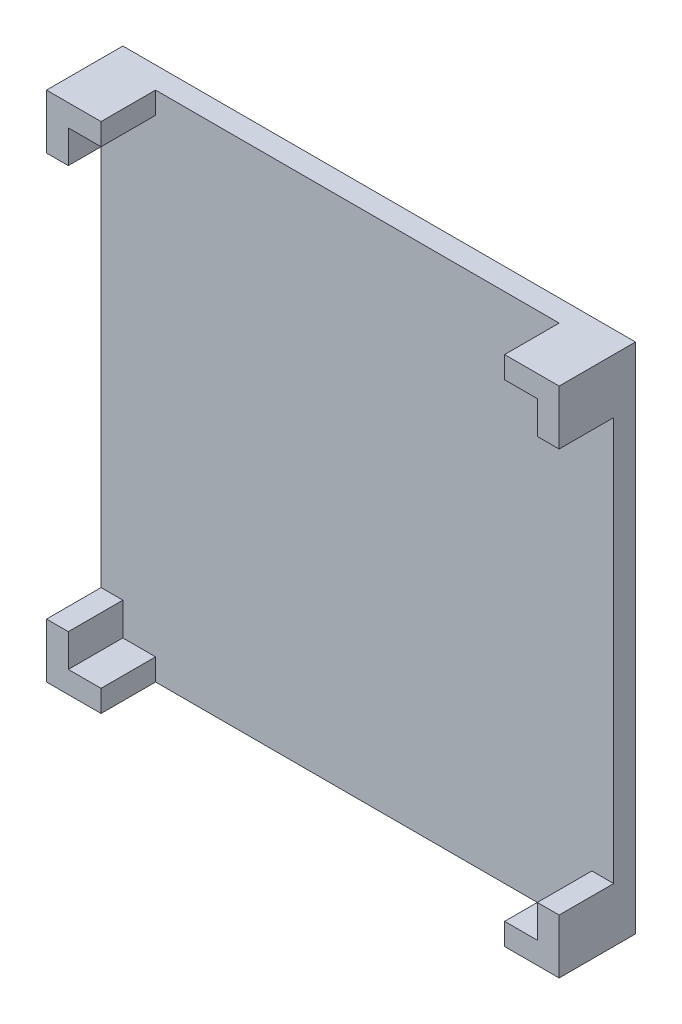
ISO-10303-21;
HEADER;
FILE_DESCRIPTION(('STEP AP214'),'2;1');
FILE_NAME('part.step','',(''),(''),'','','');
FILE_SCHEMA(('AUTOMOTIVE_DESIGN { 1 0 10303 214 1 1 1 1 }'));
ENDSEC;
DATA;
#1=APPLICATION_CONTEXT('core data for automotive mechanical design processes');
#2=APPLICATION_PROTOCOL_DEFINITION('international standard','automotive_design',2000,#1);
#3=PRODUCT_CONTEXT('',#1,'mechanical');
#4=PRODUCT('Part','Part','',(#3));
#5=PRODUCT_RELATED_PRODUCT_CATEGORY('part','',(#4));
#6=PRODUCT_DEFINITION_FORMATION('','',#4);
#7=PRODUCT_DEFINITION_CONTEXT('part definition',#1,'design');
#8=PRODUCT_DEFINITION('design','',#6,#7);
#9=PRODUCT_DEFINITION_SHAPE('','',#8);
#10=(LENGTH_UNIT() NAMED_UNIT(*) SI_UNIT(.MILLI.,.METRE.));
#11=(NAMED_UNIT(*) PLANE_ANGLE_UNIT() SI_UNIT($,.RADIAN.));
#12=(NAMED_UNIT(*) SI_UNIT($,.STERADIAN.) SOLID_ANGLE_UNIT());
#13=UNCERTAINTY_MEASURE_WITH_UNIT(LENGTH_MEASURE(1.E-05),#10,'distance_accuracy_value','');
#14=(GEOMETRIC_REPRESENTATION_CONTEXT(3) GLOBAL_UNCERTAINTY_ASSIGNED_CONTEXT((#13)) GLOBAL_UNIT_ASSIGNED_CONTEXT((#10,
#11,#12)) REPRESENTATION_CONTEXT('',''));
#15=CARTESIAN_POINT('',(0.,0.,0.));
#16=DIRECTION('',(0.,0.,1.));
#17=DIRECTION('',(1.,0.,0.));
#18=AXIS2_PLACEMENT_3D('',#15,#16,#17);
#19=CARTESIAN_POINT('',(0.,0.,2.));
#20=DIRECTION('',(0.,0.,1.));
#21=DIRECTION('',(1.,0.,0.));
#22=AXIS2_PLACEMENT_3D('',#19,#20,#21);
#23=PLANE('',#22);
#24=DIRECTION('',(0.,-1.,0.));
#25=VECTOR('',#24,1.);
#26=CARTESIAN_POINT('',(45.,5.,2.));
#27=LINE('',#26,#25);
#28=CARTESIAN_POINT('',(45.,5.,2.));
#29=VERTEX_POINT('',#28);
#30=CARTESIAN_POINT('',(45.,2.,2.));
#31=VERTEX_POINT('',#30);
#32=EDGE_CURVE('E48',#29,#31,#27,.T.);
#33=ORIENTED_EDGE('',*,*,#32,.F.);
#34=DIRECTION('',(-1.,0.,0.));
#35=VECTOR('',#34,1.);
#36=CARTESIAN_POINT('',(47.,5.,2.));
#37=LINE('',#36,#35);
#38=CARTESIAN_POINT('',(47.,5.,2.));
#39=VERTEX_POINT('',#38);
#40=EDGE_CURVE('E463',#39,#29,#37,.T.);
#41=ORIENTED_EDGE('',*,*,#40,.F.);
#42=DIRECTION('',(0.,1.,0.));
#43=VECTOR('',#42,1.);
#44=CARTESIAN_POINT('',(47.,0.,2.));
#45=LINE('',#44,#43);
#46=CARTESIAN_POINT('',(47.,42.,2.));
#47=VERTEX_POINT('',#46);
#48=EDGE_CURVE('E216',#39,#47,#45,.T.);
#49=ORIENTED_EDGE('',*,*,#48,.T.);
#50=DIRECTION('',(1.,0.,0.));
#51=VECTOR('',#50,1.);
#52=CARTESIAN_POINT('',(45.,42.,2.));
#53=LINE('',#52,#51);
#54=CARTESIAN_POINT('',(45.,42.,2.));
#55=VERTEX_POINT('',#54);
#56=EDGE_CURVE('E268',#55,#47,#53,.T.);
#57=ORIENTED_EDGE('',*,*,#56,.F.);
#58=DIRECTION('',(0.,-1.,0.));
#59=VECTOR('',#58,1.);
#60=CARTESIAN_POINT('',(45.,45.,2.));
#61=LINE('',#60,#59);
#62=CARTESIAN_POINT('',(45.,45.,2.));
#63=VERTEX_POINT('',#62);
#64=EDGE_CURVE('E285',#63,#55,#61,.T.);
#65=ORIENTED_EDGE('',*,*,#64,.F.);
#66=DIRECTION('',(1.,0.,0.));
#67=VECTOR('',#66,1.);
#68=CARTESIAN_POINT('',(42.,45.,2.));
#69=LINE('',#68,#67);
#70=CARTESIAN_POINT('',(42.,45.,2.));
#71=VERTEX_POINT('',#70);
#72=EDGE_CURVE('E282',#71,#63,#69,.T.);
#73=ORIENTED_EDGE('',*,*,#72,.F.);
#74=DIRECTION('',(0.,-1.,0.));
#75=VECTOR('',#74,1.);
#76=CARTESIAN_POINT('',(42.,47.,2.));
#77=LINE('',#76,#75);
#78=CARTESIAN_POINT('',(42.,47.,2.));
#79=VERTEX_POINT('',#78);
#80=EDGE_CURVE('E263',#79,#71,#77,.T.);
#81=ORIENTED_EDGE('',*,*,#80,.F.);
#82=DIRECTION('',(-1.,0.,0.));
#83=VECTOR('',#82,1.);
#84=CARTESIAN_POINT('',(47.,47.,2.));
#85=LINE('',#84,#83);
#86=CARTESIAN_POINT('',(5.,47.,2.));
#87=VERTEX_POINT('',#86);
#88=EDGE_CURVE('E350',#79,#87,#85,.T.);
#89=ORIENTED_EDGE('',*,*,#88,.T.);
#90=DIRECTION('',(0.,1.,0.));
#91=VECTOR('',#90,1.);
#92=CARTESIAN_POINT('',(5.,47.,2.));
#93=LINE('',#92,#91);
#94=CARTESIAN_POINT('',(5.,45.,2.));
#95=VERTEX_POINT('',#94);
#96=EDGE_CURVE('E308',#95,#87,#93,.T.);
#97=ORIENTED_EDGE('',*,*,#96,.F.);
#98=DIRECTION('',(1.,0.,0.));
#99=VECTOR('',#98,1.);
#100=CARTESIAN_POINT('',(5.,45.,2.));
#101=LINE('',#100,#99);
#102=CARTESIAN_POINT('',(2.,45.,2.));
#103=VERTEX_POINT('',#102);
#104=EDGE_CURVE('E324',#103,#95,#101,.T.);
#105=ORIENTED_EDGE('',*,*,#104,.F.);
#106=DIRECTION('',(0.,1.,0.));
#107=VECTOR('',#106,1.);
#108=CARTESIAN_POINT('',(2.,45.,2.));
#109=LINE('',#108,#107);
#110=CARTESIAN_POINT('',(2.,42.,2.));
#111=VERTEX_POINT('',#110);
#112=EDGE_CURVE('E321',#111,#103,#109,.T.);
#113=ORIENTED_EDGE('',*,*,#112,.F.);
#114=DIRECTION('',(1.,0.,0.));
#115=VECTOR('',#114,1.);
#116=CARTESIAN_POINT('',(2.,42.,2.));
#117=LINE('',#116,#115);
#118=CARTESIAN_POINT('',(0.,42.,2.));
#119=VERTEX_POINT('',#118);
#120=EDGE_CURVE('E303',#119,#111,#117,.T.);
#121=ORIENTED_EDGE('',*,*,#120,.F.);
#122=DIRECTION('',(0.,-1.,0.));
#123=VECTOR('',#122,1.);
#124=CARTESIAN_POINT('',(0.,47.,2.));
#125=LINE('',#124,#123);
#126=CARTESIAN_POINT('',(0.,5.,2.));
#127=VERTEX_POINT('',#126);
#128=EDGE_CURVE('E344',#119,#127,#125,.T.);
#129=ORIENTED_EDGE('',*,*,#128,.T.);
#130=DIRECTION('',(-1.,0.,0.));
#131=VECTOR('',#130,1.);
#132=CARTESIAN_POINT('',(2.,4.99999999999999,2.));
#133=LINE('',#132,#131);
#134=CARTESIAN_POINT('',(2.,4.99999999999999,2.));
#135=VERTEX_POINT('',#134);
#136=EDGE_CURVE('E217',#135,#127,#133,.T.);
#137=ORIENTED_EDGE('',*,*,#136,.F.);
#138=DIRECTION('',(0.,1.,0.));
#139=VECTOR('',#138,1.);
#140=CARTESIAN_POINT('',(2.,1.99999999999999,2.));
#141=LINE('',#140,#139);
#142=CARTESIAN_POINT('',(2.,1.99999999999999,2.));
#143=VERTEX_POINT('',#142);
#144=EDGE_CURVE('E230',#143,#135,#141,.T.);
#145=ORIENTED_EDGE('',*,*,#144,.F.);
#146=DIRECTION('',(-1.,0.,0.));
#147=VECTOR('',#146,1.);
#148=CARTESIAN_POINT('',(5.,1.99999999999999,2.));
#149=LINE('',#148,#147);
#150=CARTESIAN_POINT('',(5.,1.99999999999999,2.));
#151=VERTEX_POINT('',#150);
#152=EDGE_CURVE('E244',#151,#143,#149,.T.);
#153=ORIENTED_EDGE('',*,*,#152,.F.);
#154=DIRECTION('',(0.,1.,0.));
#155=VECTOR('',#154,1.);
#156=CARTESIAN_POINT('',(5.,0.,2.));
#157=LINE('',#156,#155);
#158=CARTESIAN_POINT('',(5.,0.,2.));
#159=VERTEX_POINT('',#158);
#160=EDGE_CURVE('E220',#159,#151,#157,.T.);
#161=ORIENTED_EDGE('',*,*,#160,.F.);
#162=DIRECTION('',(1.,0.,0.));
#163=VECTOR('',#162,1.);
#164=CARTESIAN_POINT('',(0.,0.,2.));
#165=LINE('',#164,#163);
#166=CARTESIAN_POINT('',(42.,0.,2.));
#167=VERTEX_POINT('',#166);
#168=EDGE_CURVE('E346',#159,#167,#165,.T.);
#169=ORIENTED_EDGE('',*,*,#168,.T.);
#170=DIRECTION('',(0.,-1.,0.));
#171=VECTOR('',#170,1.);
#172=CARTESIAN_POINT('',(42.,2.,2.));
#173=LINE('',#172,#171);
#174=CARTESIAN_POINT('',(42.,2.,2.));
#175=VERTEX_POINT('',#174);
#176=EDGE_CURVE('E212',#175,#167,#173,.T.);
#177=ORIENTED_EDGE('',*,*,#176,.F.);
#178=DIRECTION('',(-1.,0.,0.));
#179=VECTOR('',#178,1.);
#180=CARTESIAN_POINT('',(45.,2.,2.));
#181=LINE('',#180,#179);
#182=EDGE_CURVE('E53',#31,#175,#181,.T.);
#183=ORIENTED_EDGE('',*,*,#182,.F.);
#184=EDGE_LOOP('',(#33,#41,#49,#57,#65,#73,#81,#89,#97,#105,#113,#121,#129,#137,#145,#153,#161,
#169,#177,#183));
#185=FACE_BOUND('',#184,.T.);
#186=ADVANCED_FACE('F33',(#185),#23,.T.);
#187=CARTESIAN_POINT('',(0.,47.,2.));
#188=DIRECTION('',(1.,0.,0.));
#189=DIRECTION('',(0.,1.,0.));
#190=AXIS2_PLACEMENT_3D('',#187,#188,#189);
#191=PLANE('',#190);
#192=DIRECTION('',(0.,-1.,0.));
#193=VECTOR('',#192,1.);
#194=CARTESIAN_POINT('',(0.,47.,0.));
#195=LINE('',#194,#193);
#196=CARTESIAN_POINT('',(0.,47.,0.));
#197=VERTEX_POINT('',#196);
#198=CARTESIAN_POINT('',(0.,0.,0.));
#199=VERTEX_POINT('',#198);
#200=EDGE_CURVE('E343',#197,#199,#195,.T.);
#201=ORIENTED_EDGE('',*,*,#200,.T.);
#202=DIRECTION('',(0.,0.,-1.));
#203=VECTOR('',#202,1.);
#204=CARTESIAN_POINT('',(0.,0.,2.));
#205=LINE('',#204,#203);
#206=CARTESIAN_POINT('',(0.,0.,7.));
#207=VERTEX_POINT('',#206);
#208=EDGE_CURVE('E11',#207,#199,#205,.T.);
#209=ORIENTED_EDGE('',*,*,#208,.F.);
#210=DIRECTION('',(0.,-1.,0.));
#211=VECTOR('',#210,1.);
#212=CARTESIAN_POINT('',(0.,5.,7.));
#213=LINE('',#212,#211);
#214=CARTESIAN_POINT('',(0.,5.,7.));
#215=VERTEX_POINT('',#214);
#216=EDGE_CURVE('E229',#215,#207,#213,.T.);
#217=ORIENTED_EDGE('',*,*,#216,.F.);
#218=DIRECTION('',(0.,0.,-1.));
#219=VECTOR('',#218,1.);
#220=CARTESIAN_POINT('',(0.,5.,7.));
#221=LINE('',#220,#219);
#222=EDGE_CURVE('E260',#215,#127,#221,.T.);
#223=ORIENTED_EDGE('',*,*,#222,.T.);
#224=ORIENTED_EDGE('',*,*,#128,.F.);
#225=DIRECTION('',(0.,0.,-1.));
#226=VECTOR('',#225,1.);
#227=CARTESIAN_POINT('',(0.,42.,7.));
#228=LINE('',#227,#226);
#229=CARTESIAN_POINT('',(0.,42.,7.));
#230=VERTEX_POINT('',#229);
#231=EDGE_CURVE('E340',#230,#119,#228,.T.);
#232=ORIENTED_EDGE('',*,*,#231,.F.);
#233=DIRECTION('',(0.,-1.,0.));
#234=VECTOR('',#233,1.);
#235=CARTESIAN_POINT('',(0.,42.,7.));
#236=LINE('',#235,#234);
#237=CARTESIAN_POINT('',(0.,47.,7.));
#238=VERTEX_POINT('',#237);
#239=EDGE_CURVE('E307',#238,#230,#236,.T.);
#240=ORIENTED_EDGE('',*,*,#239,.F.);
#241=DIRECTION('',(0.,0.,-1.));
#242=VECTOR('',#241,1.);
#243=CARTESIAN_POINT('',(0.,47.,2.));
#244=LINE('',#243,#242);
#245=EDGE_CURVE('E352',#238,#197,#244,.T.);
#246=ORIENTED_EDGE('',*,*,#245,.T.);
#247=EDGE_LOOP('',(#201,#209,#217,#223,#224,#232,#240,#246));
#248=FACE_BOUND('',#247,.T.);
#249=ADVANCED_FACE('F35',(#248),#191,.F.);
#250=CARTESIAN_POINT('',(0.,0.,2.));
#251=DIRECTION('',(0.,1.,0.));
#252=DIRECTION('',(0.,0.,1.));
#253=AXIS2_PLACEMENT_3D('',#250,#251,#252);
#254=PLANE('',#253);
#255=DIRECTION('',(1.,0.,0.));
#256=VECTOR('',#255,1.);
#257=CARTESIAN_POINT('',(0.,0.,0.));
#258=LINE('',#257,#256);
#259=CARTESIAN_POINT('',(47.,0.,0.));
#260=VERTEX_POINT('',#259);
#261=EDGE_CURVE('E355',#199,#260,#258,.T.);
#262=ORIENTED_EDGE('',*,*,#261,.T.);
#263=DIRECTION('',(0.,0.,-1.));
#264=VECTOR('',#263,1.);
#265=CARTESIAN_POINT('',(47.,0.,2.));
#266=LINE('',#265,#264);
#267=CARTESIAN_POINT('',(47.,0.,7.));
#268=VERTEX_POINT('',#267);
#269=EDGE_CURVE('E41',#268,#260,#266,.T.);
#270=ORIENTED_EDGE('',*,*,#269,.F.);
#271=DIRECTION('',(1.,0.,0.));
#272=VECTOR('',#271,1.);
#273=CARTESIAN_POINT('',(42.,0.,7.));
#274=LINE('',#273,#272);
#275=CARTESIAN_POINT('',(42.,0.,7.));
#276=VERTEX_POINT('',#275);
#277=EDGE_CURVE('E209',#276,#268,#274,.T.);
#278=ORIENTED_EDGE('',*,*,#277,.F.);
#279=DIRECTION('',(0.,0.,-1.));
#280=VECTOR('',#279,1.);
#281=CARTESIAN_POINT('',(42.,0.,7.));
#282=LINE('',#281,#280);
#283=EDGE_CURVE('E442',#276,#167,#282,.T.);
#284=ORIENTED_EDGE('',*,*,#283,.T.);
#285=ORIENTED_EDGE('',*,*,#168,.F.);
#286=DIRECTION('',(0.,0.,-1.));
#287=VECTOR('',#286,1.);
#288=CARTESIAN_POINT('',(5.,0.,7.));
#289=LINE('',#288,#287);
#290=CARTESIAN_POINT('',(5.,0.,7.));
#291=VERTEX_POINT('',#290);
#292=EDGE_CURVE('E257',#291,#159,#289,.T.);
#293=ORIENTED_EDGE('',*,*,#292,.F.);
#294=DIRECTION('',(1.,0.,0.));
#295=VECTOR('',#294,1.);
#296=CARTESIAN_POINT('',(0.,0.,7.));
#297=LINE('',#296,#295);
#298=EDGE_CURVE('E233',#207,#291,#297,.T.);
#299=ORIENTED_EDGE('',*,*,#298,.F.);
#300=ORIENTED_EDGE('',*,*,#208,.T.);
#301=EDGE_LOOP('',(#262,#270,#278,#284,#285,#293,#299,#300));
#302=FACE_BOUND('',#301,.T.);
#303=ADVANCED_FACE('F411',(#302),#254,.F.);
#304=CARTESIAN_POINT('',(47.,0.,2.));
#305=DIRECTION('',(-1.,0.,0.));
#306=DIRECTION('',(0.,0.,1.));
#307=AXIS2_PLACEMENT_3D('',#304,#305,#306);
#308=PLANE('',#307);
#309=DIRECTION('',(0.,1.,0.));
#310=VECTOR('',#309,1.);
#311=CARTESIAN_POINT('',(47.,0.,0.));
#312=LINE('',#311,#310);
#313=CARTESIAN_POINT('',(47.,47.,0.));
#314=VERTEX_POINT('',#313);
#315=EDGE_CURVE('E357',#260,#314,#312,.T.);
#316=ORIENTED_EDGE('',*,*,#315,.T.);
#317=DIRECTION('',(0.,0.,-1.));
#318=VECTOR('',#317,1.);
#319=CARTESIAN_POINT('',(47.,47.,2.));
#320=LINE('',#319,#318);
#321=CARTESIAN_POINT('',(47.,47.,7.));
#322=VERTEX_POINT('',#321);
#323=EDGE_CURVE('E362',#322,#314,#320,.T.);
#324=ORIENTED_EDGE('',*,*,#323,.F.);
#325=DIRECTION('',(0.,1.,0.));
#326=VECTOR('',#325,1.);
#327=CARTESIAN_POINT('',(47.,42.,7.));
#328=LINE('',#327,#326);
#329=CARTESIAN_POINT('',(47.,42.,7.));
#330=VERTEX_POINT('',#329);
#331=EDGE_CURVE('E276',#330,#322,#328,.T.);
#332=ORIENTED_EDGE('',*,*,#331,.F.);
#333=DIRECTION('',(0.,0.,-1.));
#334=VECTOR('',#333,1.);
#335=CARTESIAN_POINT('',(47.,42.,7.));
#336=LINE('',#335,#334);
#337=EDGE_CURVE('E279',#330,#47,#336,.T.);
#338=ORIENTED_EDGE('',*,*,#337,.T.);
#339=ORIENTED_EDGE('',*,*,#48,.F.);
#340=DIRECTION('',(0.,0.,-1.));
#341=VECTOR('',#340,1.);
#342=CARTESIAN_POINT('',(47.,5.,7.));
#343=LINE('',#342,#341);
#344=CARTESIAN_POINT('',(47.,5.,7.));
#345=VERTEX_POINT('',#344);
#346=EDGE_CURVE('E197',#345,#39,#343,.T.);
#347=ORIENTED_EDGE('',*,*,#346,.F.);
#348=DIRECTION('',(0.,1.,0.));
#349=VECTOR('',#348,1.);
#350=CARTESIAN_POINT('',(47.,0.,7.));
#351=LINE('',#350,#349);
#352=EDGE_CURVE('E203',#268,#345,#351,.T.);
#353=ORIENTED_EDGE('',*,*,#352,.F.);
#354=ORIENTED_EDGE('',*,*,#269,.T.);
#355=EDGE_LOOP('',(#316,#324,#332,#338,#339,#347,#353,#354));
#356=FACE_BOUND('',#355,.T.);
#357=ADVANCED_FACE('F214',(#356),#308,.F.);
#358=CARTESIAN_POINT('',(47.,47.,2.));
#359=DIRECTION('',(0.,-1.,0.));
#360=DIRECTION('',(1.,0.,0.));
#361=AXIS2_PLACEMENT_3D('',#358,#359,#360);
#362=PLANE('',#361);
#363=DIRECTION('',(-1.,0.,0.));
#364=VECTOR('',#363,1.);
#365=CARTESIAN_POINT('',(47.,47.,0.));
#366=LINE('',#365,#364);
#367=EDGE_CURVE('E347',#314,#197,#366,.T.);
#368=ORIENTED_EDGE('',*,*,#367,.T.);
#369=ORIENTED_EDGE('',*,*,#245,.F.);
#370=DIRECTION('',(-1.,0.,0.));
#371=VECTOR('',#370,1.);
#372=CARTESIAN_POINT('',(0.,47.,7.));
#373=LINE('',#372,#371);
#374=CARTESIAN_POINT('',(5.,47.,7.));
#375=VERTEX_POINT('',#374);
#376=EDGE_CURVE('E304',#375,#238,#373,.T.);
#377=ORIENTED_EDGE('',*,*,#376,.F.);
#378=DIRECTION('',(0.,0.,-1.));
#379=VECTOR('',#378,1.);
#380=CARTESIAN_POINT('',(5.,47.,7.));
#381=LINE('',#380,#379);
#382=EDGE_CURVE('E318',#375,#87,#381,.T.);
#383=ORIENTED_EDGE('',*,*,#382,.T.);
#384=ORIENTED_EDGE('',*,*,#88,.F.);
#385=DIRECTION('',(0.,0.,-1.));
#386=VECTOR('',#385,1.);
#387=CARTESIAN_POINT('',(42.,47.,7.));
#388=LINE('',#387,#386);
#389=CARTESIAN_POINT('',(42.,47.,7.));
#390=VERTEX_POINT('',#389);
#391=EDGE_CURVE('E300',#390,#79,#388,.T.);
#392=ORIENTED_EDGE('',*,*,#391,.F.);
#393=DIRECTION('',(-1.,0.,0.));
#394=VECTOR('',#393,1.);
#395=CARTESIAN_POINT('',(47.,47.,7.));
#396=LINE('',#395,#394);
#397=EDGE_CURVE('E264',#322,#390,#396,.T.);
#398=ORIENTED_EDGE('',*,*,#397,.F.);
#399=ORIENTED_EDGE('',*,*,#323,.T.);
#400=EDGE_LOOP('',(#368,#369,#377,#383,#384,#392,#398,#399));
#401=FACE_BOUND('',#400,.T.);
#402=ADVANCED_FACE('F371',(#401),#362,.F.);
#403=CARTESIAN_POINT('',(0.,0.,0.));
#404=DIRECTION('',(0.,0.,1.));
#405=DIRECTION('',(1.,0.,0.));
#406=AXIS2_PLACEMENT_3D('',#403,#404,#405);
#407=PLANE('',#406);
#408=ORIENTED_EDGE('',*,*,#200,.F.);
#409=ORIENTED_EDGE('',*,*,#367,.F.);
#410=ORIENTED_EDGE('',*,*,#315,.F.);
#411=ORIENTED_EDGE('',*,*,#261,.F.);
#412=EDGE_LOOP('',(#408,#409,#410,#411));
#413=FACE_BOUND('',#412,.T.);
#414=ADVANCED_FACE('F369',(#413),#407,.F.);
#415=CARTESIAN_POINT('',(2.,42.,7.));
#416=DIRECTION('',(0.,1.,0.));
#417=DIRECTION('',(0.,0.,1.));
#418=AXIS2_PLACEMENT_3D('',#415,#416,#417);
#419=PLANE('',#418);
#420=ORIENTED_EDGE('',*,*,#120,.T.);
#421=DIRECTION('',(0.,0.,-1.));
#422=VECTOR('',#421,1.);
#423=CARTESIAN_POINT('',(2.,42.,7.));
#424=LINE('',#423,#422);
#425=CARTESIAN_POINT('',(2.,42.,7.));
#426=VERTEX_POINT('',#425);
#427=EDGE_CURVE('E337',#426,#111,#424,.T.);
#428=ORIENTED_EDGE('',*,*,#427,.F.);
#429=DIRECTION('',(1.,0.,0.));
#430=VECTOR('',#429,1.);
#431=CARTESIAN_POINT('',(2.,42.,7.));
#432=LINE('',#431,#430);
#433=EDGE_CURVE('E310',#230,#426,#432,.T.);
#434=ORIENTED_EDGE('',*,*,#433,.F.);
#435=ORIENTED_EDGE('',*,*,#231,.T.);
#436=EDGE_LOOP('',(#420,#428,#434,#435));
#437=FACE_BOUND('',#436,.T.);
#438=ADVANCED_FACE('F397',(#437),#419,.F.);
#439=CARTESIAN_POINT('',(2.,45.,7.));
#440=DIRECTION('',(-1.,0.,0.));
#441=DIRECTION('',(0.,-1.,0.));
#442=AXIS2_PLACEMENT_3D('',#439,#440,#441);
#443=PLANE('',#442);
#444=ORIENTED_EDGE('',*,*,#112,.T.);
#445=DIRECTION('',(0.,0.,-1.));
#446=VECTOR('',#445,1.);
#447=CARTESIAN_POINT('',(2.,45.,7.));
#448=LINE('',#447,#446);
#449=CARTESIAN_POINT('',(2.,45.,7.));
#450=VERTEX_POINT('',#449);
#451=EDGE_CURVE('E334',#450,#103,#448,.T.);
#452=ORIENTED_EDGE('',*,*,#451,.F.);
#453=DIRECTION('',(0.,1.,0.));
#454=VECTOR('',#453,1.);
#455=CARTESIAN_POINT('',(2.,45.,7.));
#456=LINE('',#455,#454);
#457=EDGE_CURVE('E312',#426,#450,#456,.T.);
#458=ORIENTED_EDGE('',*,*,#457,.F.);
#459=ORIENTED_EDGE('',*,*,#427,.T.);
#460=EDGE_LOOP('',(#444,#452,#458,#459));
#461=FACE_BOUND('',#460,.T.);
#462=ADVANCED_FACE('F394',(#461),#443,.F.);
#463=CARTESIAN_POINT('',(5.,45.,7.));
#464=DIRECTION('',(0.,1.,0.));
#465=DIRECTION('',(0.,0.,1.));
#466=AXIS2_PLACEMENT_3D('',#463,#464,#465);
#467=PLANE('',#466);
#468=ORIENTED_EDGE('',*,*,#104,.T.);
#469=DIRECTION('',(0.,0.,-1.));
#470=VECTOR('',#469,1.);
#471=CARTESIAN_POINT('',(5.,45.,7.));
#472=LINE('',#471,#470);
#473=CARTESIAN_POINT('',(5.,45.,7.));
#474=VERTEX_POINT('',#473);
#475=EDGE_CURVE('E331',#474,#95,#472,.T.);
#476=ORIENTED_EDGE('',*,*,#475,.F.);
#477=DIRECTION('',(1.,0.,0.));
#478=VECTOR('',#477,1.);
#479=CARTESIAN_POINT('',(5.,45.,7.));
#480=LINE('',#479,#478);
#481=EDGE_CURVE('E314',#450,#474,#480,.T.);
#482=ORIENTED_EDGE('',*,*,#481,.F.);
#483=ORIENTED_EDGE('',*,*,#451,.T.);
#484=EDGE_LOOP('',(#468,#476,#482,#483));
#485=FACE_BOUND('',#484,.T.);
#486=ADVANCED_FACE('F389',(#485),#467,.F.);
#487=CARTESIAN_POINT('',(5.,47.,7.));
#488=DIRECTION('',(-1.,0.,0.));
#489=DIRECTION('',(0.,0.,1.));
#490=AXIS2_PLACEMENT_3D('',#487,#488,#489);
#491=PLANE('',#490);
#492=ORIENTED_EDGE('',*,*,#96,.T.);
#493=ORIENTED_EDGE('',*,*,#382,.F.);
#494=DIRECTION('',(0.,1.,0.));
#495=VECTOR('',#494,1.);
#496=CARTESIAN_POINT('',(5.,47.,7.));
#497=LINE('',#496,#495);
#498=EDGE_CURVE('E316',#474,#375,#497,.T.);
#499=ORIENTED_EDGE('',*,*,#498,.F.);
#500=ORIENTED_EDGE('',*,*,#475,.T.);
#501=EDGE_LOOP('',(#492,#493,#499,#500));
#502=FACE_BOUND('',#501,.T.);
#503=ADVANCED_FACE('F386',(#502),#491,.F.);
#504=CARTESIAN_POINT('',(0.,0.,7.));
#505=DIRECTION('',(0.,0.,-1.));
#506=DIRECTION('',(-1.,0.,0.));
#507=AXIS2_PLACEMENT_3D('',#504,#505,#506);
#508=PLANE('',#507);
#509=ORIENTED_EDGE('',*,*,#376,.T.);
#510=ORIENTED_EDGE('',*,*,#239,.T.);
#511=ORIENTED_EDGE('',*,*,#433,.T.);
#512=ORIENTED_EDGE('',*,*,#457,.T.);
#513=ORIENTED_EDGE('',*,*,#481,.T.);
#514=ORIENTED_EDGE('',*,*,#498,.T.);
#515=EDGE_LOOP('',(#509,#510,#511,#512,#513,#514));
#516=FACE_BOUND('',#515,.T.);
#517=ADVANCED_FACE('F380',(#516),#508,.F.);
#518=CARTESIAN_POINT('',(42.,47.,7.));
#519=DIRECTION('',(1.,0.,0.));
#520=DIRECTION('',(0.,0.,-1.));
#521=AXIS2_PLACEMENT_3D('',#518,#519,#520);
#522=PLANE('',#521);
#523=ORIENTED_EDGE('',*,*,#80,.T.);
#524=DIRECTION('',(0.,0.,-1.));
#525=VECTOR('',#524,1.);
#526=CARTESIAN_POINT('',(42.,45.,7.));
#527=LINE('',#526,#525);
#528=CARTESIAN_POINT('',(42.,45.,7.));
#529=VERTEX_POINT('',#528);
#530=EDGE_CURVE('E297',#529,#71,#527,.T.);
#531=ORIENTED_EDGE('',*,*,#530,.F.);
#532=DIRECTION('',(0.,-1.,0.));
#533=VECTOR('',#532,1.);
#534=CARTESIAN_POINT('',(42.,47.,7.));
#535=LINE('',#534,#533);
#536=EDGE_CURVE('E267',#390,#529,#535,.T.);
#537=ORIENTED_EDGE('',*,*,#536,.F.);
#538=ORIENTED_EDGE('',*,*,#391,.T.);
#539=EDGE_LOOP('',(#523,#531,#537,#538));
#540=FACE_BOUND('',#539,.T.);
#541=ADVANCED_FACE('F479',(#540),#522,.F.);
#542=CARTESIAN_POINT('',(42.,45.,7.));
#543=DIRECTION('',(0.,1.,0.));
#544=DIRECTION('',(0.,0.,1.));
#545=AXIS2_PLACEMENT_3D('',#542,#543,#544);
#546=PLANE('',#545);
#547=ORIENTED_EDGE('',*,*,#72,.T.);
#548=DIRECTION('',(0.,0.,-1.));
#549=VECTOR('',#548,1.);
#550=CARTESIAN_POINT('',(45.,45.,7.));
#551=LINE('',#550,#549);
#552=CARTESIAN_POINT('',(45.,45.,7.));
#553=VERTEX_POINT('',#552);
#554=EDGE_CURVE('E294',#553,#63,#551,.T.);
#555=ORIENTED_EDGE('',*,*,#554,.F.);
#556=DIRECTION('',(1.,0.,0.));
#557=VECTOR('',#556,1.);
#558=CARTESIAN_POINT('',(42.,45.,7.));
#559=LINE('',#558,#557);
#560=EDGE_CURVE('E270',#529,#553,#559,.T.);
#561=ORIENTED_EDGE('',*,*,#560,.F.);
#562=ORIENTED_EDGE('',*,*,#530,.T.);
#563=EDGE_LOOP('',(#547,#555,#561,#562));
#564=FACE_BOUND('',#563,.T.);
#565=ADVANCED_FACE('F485',(#564),#546,.F.);
#566=CARTESIAN_POINT('',(45.,45.,7.));
#567=DIRECTION('',(1.,0.,0.));
#568=DIRECTION('',(0.,0.,-1.));
#569=AXIS2_PLACEMENT_3D('',#566,#567,#568);
#570=PLANE('',#569);
#571=ORIENTED_EDGE('',*,*,#64,.T.);
#572=DIRECTION('',(0.,0.,-1.));
#573=VECTOR('',#572,1.);
#574=CARTESIAN_POINT('',(45.,42.,7.));
#575=LINE('',#574,#573);
#576=CARTESIAN_POINT('',(45.,42.,7.));
#577=VERTEX_POINT('',#576);
#578=EDGE_CURVE('E291',#577,#55,#575,.T.);
#579=ORIENTED_EDGE('',*,*,#578,.F.);
#580=DIRECTION('',(0.,-1.,0.));
#581=VECTOR('',#580,1.);
#582=CARTESIAN_POINT('',(45.,45.,7.));
#583=LINE('',#582,#581);
#584=EDGE_CURVE('E272',#553,#577,#583,.T.);
#585=ORIENTED_EDGE('',*,*,#584,.F.);
#586=ORIENTED_EDGE('',*,*,#554,.T.);
#587=EDGE_LOOP('',(#571,#579,#585,#586));
#588=FACE_BOUND('',#587,.T.);
#589=ADVANCED_FACE('F487',(#588),#570,.F.);
#590=CARTESIAN_POINT('',(45.,42.,7.));
#591=DIRECTION('',(0.,1.,0.));
#592=DIRECTION('',(0.,0.,1.));
#593=AXIS2_PLACEMENT_3D('',#590,#591,#592);
#594=PLANE('',#593);
#595=ORIENTED_EDGE('',*,*,#56,.T.);
#596=ORIENTED_EDGE('',*,*,#337,.F.);
#597=DIRECTION('',(1.,0.,0.));
#598=VECTOR('',#597,1.);
#599=CARTESIAN_POINT('',(45.,42.,7.));
#600=LINE('',#599,#598);
#601=EDGE_CURVE('E274',#577,#330,#600,.T.);
#602=ORIENTED_EDGE('',*,*,#601,.F.);
#603=ORIENTED_EDGE('',*,*,#578,.T.);
#604=EDGE_LOOP('',(#595,#596,#602,#603));
#605=FACE_BOUND('',#604,.T.);
#606=ADVANCED_FACE('F472',(#605),#594,.F.);
#607=CARTESIAN_POINT('',(0.,0.,7.));
#608=DIRECTION('',(0.,0.,1.));
#609=DIRECTION('',(1.,0.,0.));
#610=AXIS2_PLACEMENT_3D('',#607,#608,#609);
#611=PLANE('',#610);
#612=ORIENTED_EDGE('',*,*,#397,.T.);
#613=ORIENTED_EDGE('',*,*,#536,.T.);
#614=ORIENTED_EDGE('',*,*,#560,.T.);
#615=ORIENTED_EDGE('',*,*,#584,.T.);
#616=ORIENTED_EDGE('',*,*,#601,.T.);
#617=ORIENTED_EDGE('',*,*,#331,.T.);
#618=EDGE_LOOP('',(#612,#613,#614,#615,#616,#617));
#619=FACE_BOUND('',#618,.T.);
#620=ADVANCED_FACE('F477',(#619),#611,.T.);
#621=CARTESIAN_POINT('',(2.,4.99999999999999,7.));
#622=DIRECTION('',(0.,-1.,0.));
#623=DIRECTION('',(1.,0.,0.));
#624=AXIS2_PLACEMENT_3D('',#621,#622,#623);
#625=PLANE('',#624);
#626=ORIENTED_EDGE('',*,*,#136,.T.);
#627=ORIENTED_EDGE('',*,*,#222,.F.);
#628=DIRECTION('',(-1.,0.,0.));
#629=VECTOR('',#628,1.);
#630=CARTESIAN_POINT('',(2.,4.99999999999999,7.));
#631=LINE('',#630,#629);
#632=CARTESIAN_POINT('',(2.,4.99999999999999,7.));
#633=VERTEX_POINT('',#632);
#634=EDGE_CURVE('E226',#633,#215,#631,.T.);
#635=ORIENTED_EDGE('',*,*,#634,.F.);
#636=DIRECTION('',(0.,0.,-1.));
#637=VECTOR('',#636,1.);
#638=CARTESIAN_POINT('',(2.,4.99999999999999,7.));
#639=LINE('',#638,#637);
#640=EDGE_CURVE('E240',#633,#135,#639,.T.);
#641=ORIENTED_EDGE('',*,*,#640,.T.);
#642=EDGE_LOOP('',(#626,#627,#635,#641));
#643=FACE_BOUND('',#642,.T.);
#644=ADVANCED_FACE('F428',(#643),#625,.F.);
#645=CARTESIAN_POINT('',(5.,0.,7.));
#646=DIRECTION('',(-1.,0.,0.));
#647=DIRECTION('',(0.,0.,1.));
#648=AXIS2_PLACEMENT_3D('',#645,#646,#647);
#649=PLANE('',#648);
#650=ORIENTED_EDGE('',*,*,#160,.T.);
#651=DIRECTION('',(0.,0.,-1.));
#652=VECTOR('',#651,1.);
#653=CARTESIAN_POINT('',(5.,1.99999999999999,7.));
#654=LINE('',#653,#652);
#655=CARTESIAN_POINT('',(5.,1.99999999999999,7.));
#656=VERTEX_POINT('',#655);
#657=EDGE_CURVE('E254',#656,#151,#654,.T.);
#658=ORIENTED_EDGE('',*,*,#657,.F.);
#659=DIRECTION('',(0.,1.,0.));
#660=VECTOR('',#659,1.);
#661=CARTESIAN_POINT('',(5.,0.,7.));
#662=LINE('',#661,#660);
#663=EDGE_CURVE('E235',#291,#656,#662,.T.);
#664=ORIENTED_EDGE('',*,*,#663,.F.);
#665=ORIENTED_EDGE('',*,*,#292,.T.);
#666=EDGE_LOOP('',(#650,#658,#664,#665));
#667=FACE_BOUND('',#666,.T.);
#668=ADVANCED_FACE('F438',(#667),#649,.F.);
#669=CARTESIAN_POINT('',(5.,1.99999999999999,7.));
#670=DIRECTION('',(0.,-1.,0.));
#671=DIRECTION('',(1.,0.,0.));
#672=AXIS2_PLACEMENT_3D('',#669,#670,#671);
#673=PLANE('',#672);
#674=ORIENTED_EDGE('',*,*,#152,.T.);
#675=DIRECTION('',(0.,0.,-1.));
#676=VECTOR('',#675,1.);
#677=CARTESIAN_POINT('',(2.,1.99999999999999,7.));
#678=LINE('',#677,#676);
#679=CARTESIAN_POINT('',(2.,1.99999999999999,7.));
#680=VERTEX_POINT('',#679);
#681=EDGE_CURVE('E251',#680,#143,#678,.T.);
#682=ORIENTED_EDGE('',*,*,#681,.F.);
#683=DIRECTION('',(-1.,0.,0.));
#684=VECTOR('',#683,1.);
#685=CARTESIAN_POINT('',(5.,1.99999999999999,7.));
#686=LINE('',#685,#684);
#687=EDGE_CURVE('E237',#656,#680,#686,.T.);
#688=ORIENTED_EDGE('',*,*,#687,.F.);
#689=ORIENTED_EDGE('',*,*,#657,.T.);
#690=EDGE_LOOP('',(#674,#682,#688,#689));
#691=FACE_BOUND('',#690,.T.);
#692=ADVANCED_FACE('F434',(#691),#673,.F.);
#693=CARTESIAN_POINT('',(2.,1.99999999999999,7.));
#694=DIRECTION('',(-1.,0.,0.));
#695=DIRECTION('',(0.,0.,1.));
#696=AXIS2_PLACEMENT_3D('',#693,#694,#695);
#697=PLANE('',#696);
#698=ORIENTED_EDGE('',*,*,#144,.T.);
#699=ORIENTED_EDGE('',*,*,#640,.F.);
#700=DIRECTION('',(0.,1.,0.));
#701=VECTOR('',#700,1.);
#702=CARTESIAN_POINT('',(2.,1.99999999999999,7.));
#703=LINE('',#702,#701);
#704=EDGE_CURVE('E239',#680,#633,#703,.T.);
#705=ORIENTED_EDGE('',*,*,#704,.F.);
#706=ORIENTED_EDGE('',*,*,#681,.T.);
#707=EDGE_LOOP('',(#698,#699,#705,#706));
#708=FACE_BOUND('',#707,.T.);
#709=ADVANCED_FACE('F430',(#708),#697,.F.);
#710=CARTESIAN_POINT('',(0.,0.,7.));
#711=DIRECTION('',(0.,0.,1.));
#712=DIRECTION('',(1.,0.,0.));
#713=AXIS2_PLACEMENT_3D('',#710,#711,#712);
#714=PLANE('',#713);
#715=ORIENTED_EDGE('',*,*,#634,.T.);
#716=ORIENTED_EDGE('',*,*,#216,.T.);
#717=ORIENTED_EDGE('',*,*,#298,.T.);
#718=ORIENTED_EDGE('',*,*,#663,.T.);
#719=ORIENTED_EDGE('',*,*,#687,.T.);
#720=ORIENTED_EDGE('',*,*,#704,.T.);
#721=EDGE_LOOP('',(#715,#716,#717,#718,#719,#720));
#722=FACE_BOUND('',#721,.T.);
#723=ADVANCED_FACE('F422',(#722),#714,.T.);
#724=CARTESIAN_POINT('',(47.,5.,7.));
#725=DIRECTION('',(0.,-1.,0.));
#726=DIRECTION('',(1.,0.,0.));
#727=AXIS2_PLACEMENT_3D('',#724,#725,#726);
#728=PLANE('',#727);
#729=ORIENTED_EDGE('',*,*,#40,.T.);
#730=DIRECTION('',(0.,0.,-1.));
#731=VECTOR('',#730,1.);
#732=CARTESIAN_POINT('',(45.,5.,7.));
#733=LINE('',#732,#731);
#734=CARTESIAN_POINT('',(45.,5.,7.));
#735=VERTEX_POINT('',#734);
#736=EDGE_CURVE('E199',#735,#29,#733,.T.);
#737=ORIENTED_EDGE('',*,*,#736,.F.);
#738=DIRECTION('',(-1.,0.,0.));
#739=VECTOR('',#738,1.);
#740=CARTESIAN_POINT('',(47.,5.,7.));
#741=LINE('',#740,#739);
#742=EDGE_CURVE('E193',#345,#735,#741,.T.);
#743=ORIENTED_EDGE('',*,*,#742,.F.);
#744=ORIENTED_EDGE('',*,*,#346,.T.);
#745=EDGE_LOOP('',(#729,#737,#743,#744));
#746=FACE_BOUND('',#745,.T.);
#747=ADVANCED_FACE('F195',(#746),#728,.F.);
#748=CARTESIAN_POINT('',(45.,5.,7.));
#749=DIRECTION('',(1.,0.,0.));
#750=DIRECTION('',(0.,0.,-1.));
#751=AXIS2_PLACEMENT_3D('',#748,#749,#750);
#752=PLANE('',#751);
#753=ORIENTED_EDGE('',*,*,#32,.T.);
#754=DIRECTION('',(0.,0.,-1.));
#755=VECTOR('',#754,1.);
#756=CARTESIAN_POINT('',(45.,2.,7.));
#757=LINE('',#756,#755);
#758=CARTESIAN_POINT('',(45.,2.,7.));
#759=VERTEX_POINT('',#758);
#760=EDGE_CURVE('E222',#759,#31,#757,.T.);
#761=ORIENTED_EDGE('',*,*,#760,.F.);
#762=DIRECTION('',(0.,-1.,0.));
#763=VECTOR('',#762,1.);
#764=CARTESIAN_POINT('',(45.,5.,7.));
#765=LINE('',#764,#763);
#766=EDGE_CURVE('E202',#735,#759,#765,.T.);
#767=ORIENTED_EDGE('',*,*,#766,.F.);
#768=ORIENTED_EDGE('',*,*,#736,.T.);
#769=EDGE_LOOP('',(#753,#761,#767,#768));
#770=FACE_BOUND('',#769,.T.);
#771=ADVANCED_FACE('F462',(#770),#752,.F.);
#772=CARTESIAN_POINT('',(45.,2.,7.));
#773=DIRECTION('',(0.,-1.,0.));
#774=DIRECTION('',(1.,0.,0.));
#775=AXIS2_PLACEMENT_3D('',#772,#773,#774);
#776=PLANE('',#775);
#777=ORIENTED_EDGE('',*,*,#182,.T.);
#778=DIRECTION('',(0.,0.,-1.));
#779=VECTOR('',#778,1.);
#780=CARTESIAN_POINT('',(42.,2.,7.));
#781=LINE('',#780,#779);
#782=CARTESIAN_POINT('',(42.,2.,7.));
#783=VERTEX_POINT('',#782);
#784=EDGE_CURVE('E449',#783,#175,#781,.T.);
#785=ORIENTED_EDGE('',*,*,#784,.F.);
#786=DIRECTION('',(-1.,0.,0.));
#787=VECTOR('',#786,1.);
#788=CARTESIAN_POINT('',(45.,2.,7.));
#789=LINE('',#788,#787);
#790=EDGE_CURVE('E460',#759,#783,#789,.T.);
#791=ORIENTED_EDGE('',*,*,#790,.F.);
#792=ORIENTED_EDGE('',*,*,#760,.T.);
#793=EDGE_LOOP('',(#777,#785,#791,#792));
#794=FACE_BOUND('',#793,.T.);
#795=ADVANCED_FACE('F459',(#794),#776,.F.);
#796=CARTESIAN_POINT('',(42.,2.,7.));
#797=DIRECTION('',(1.,0.,0.));
#798=DIRECTION('',(0.,0.,-1.));
#799=AXIS2_PLACEMENT_3D('',#796,#797,#798);
#800=PLANE('',#799);
#801=ORIENTED_EDGE('',*,*,#176,.T.);
#802=ORIENTED_EDGE('',*,*,#283,.F.);
#803=DIRECTION('',(0.,-1.,0.));
#804=VECTOR('',#803,1.);
#805=CARTESIAN_POINT('',(42.,2.,7.));
#806=LINE('',#805,#804);
#807=EDGE_CURVE('E467',#783,#276,#806,.T.);
#808=ORIENTED_EDGE('',*,*,#807,.F.);
#809=ORIENTED_EDGE('',*,*,#784,.T.);
#810=EDGE_LOOP('',(#801,#802,#808,#809));
#811=FACE_BOUND('',#810,.T.);
#812=ADVANCED_FACE('F446',(#811),#800,.F.);
#813=CARTESIAN_POINT('',(0.,0.,7.));
#814=DIRECTION('',(0.,0.,1.));
#815=DIRECTION('',(1.,0.,0.));
#816=AXIS2_PLACEMENT_3D('',#813,#814,#815);
#817=PLANE('',#816);
#818=ORIENTED_EDGE('',*,*,#352,.T.);
#819=ORIENTED_EDGE('',*,*,#742,.T.);
#820=ORIENTED_EDGE('',*,*,#766,.T.);
#821=ORIENTED_EDGE('',*,*,#790,.T.);
#822=ORIENTED_EDGE('',*,*,#807,.T.);
#823=ORIENTED_EDGE('',*,*,#277,.T.);
#824=EDGE_LOOP('',(#818,#819,#820,#821,#822,#823));
#825=FACE_BOUND('',#824,.T.);
#826=ADVANCED_FACE('F207',(#825),#817,.T.);
#827=CLOSED_SHELL('',(#186,#249,#303,#357,#402,#414,#438,#462,#486,#503,#517,#541,#565,#589,
#606,#620,#644,#668,#692,#709,#723,#747,#771,#795,#812,#826));
#828=MANIFOLD_SOLID_BREP('B2',#827);
#829=ADVANCED_BREP_SHAPE_REPRESENTATION('',(#18,#828),#14);
#830=SHAPE_DEFINITION_REPRESENTATION(#9,#829);
ENDSEC;
END-ISO-10303-21;
